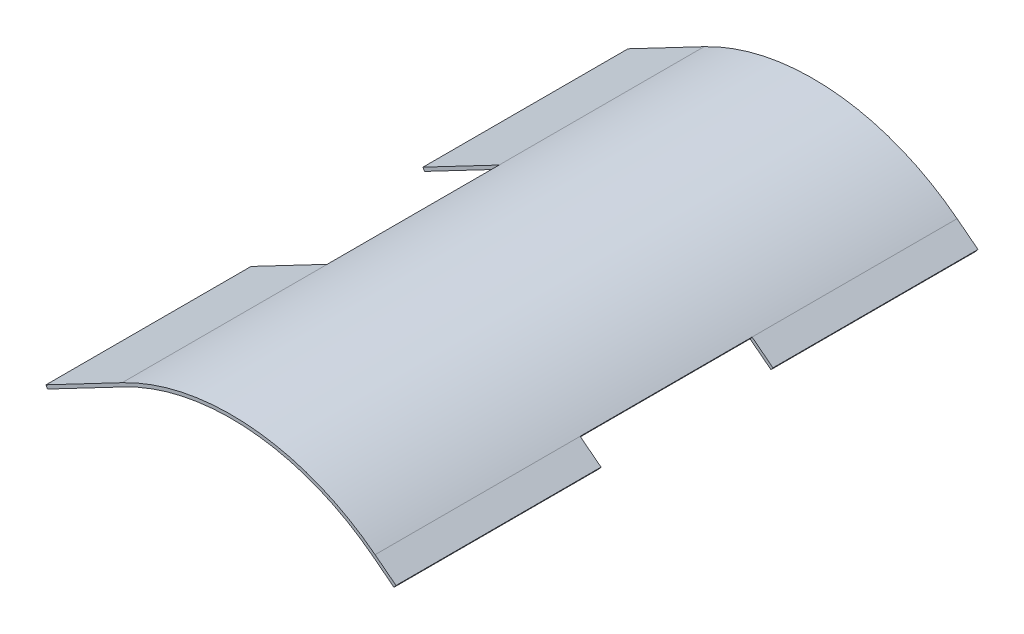
ISO-10303-21;
HEADER;
FILE_DESCRIPTION(('STEP AP214'),'2;1');
FILE_NAME('part.step','',(''),(''),'','','');
FILE_SCHEMA(('AUTOMOTIVE_DESIGN { 1 0 10303 214 1 1 1 1 }'));
ENDSEC;
DATA;
#1=APPLICATION_CONTEXT('core data for automotive mechanical design processes');
#2=APPLICATION_PROTOCOL_DEFINITION('international standard','automotive_design',2000,#1);
#3=PRODUCT_CONTEXT('',#1,'mechanical');
#4=PRODUCT('Part','Part','',(#3));
#5=PRODUCT_RELATED_PRODUCT_CATEGORY('part','',(#4));
#6=PRODUCT_DEFINITION_FORMATION('','',#4);
#7=PRODUCT_DEFINITION_CONTEXT('part definition',#1,'design');
#8=PRODUCT_DEFINITION('design','',#6,#7);
#9=PRODUCT_DEFINITION_SHAPE('','',#8);
#10=(LENGTH_UNIT() NAMED_UNIT(*) SI_UNIT(.MILLI.,.METRE.));
#11=(NAMED_UNIT(*) PLANE_ANGLE_UNIT() SI_UNIT($,.RADIAN.));
#12=(NAMED_UNIT(*) SI_UNIT($,.STERADIAN.) SOLID_ANGLE_UNIT());
#13=UNCERTAINTY_MEASURE_WITH_UNIT(LENGTH_MEASURE(1.E-05),#10,'distance_accuracy_value','');
#14=(GEOMETRIC_REPRESENTATION_CONTEXT(3) GLOBAL_UNCERTAINTY_ASSIGNED_CONTEXT((#13)) GLOBAL_UNIT_ASSIGNED_CONTEXT((#10,
#11,#12)) REPRESENTATION_CONTEXT('',''));
#15=CARTESIAN_POINT('',(0.,0.,0.));
#16=DIRECTION('',(0.,0.,1.));
#17=DIRECTION('',(1.,0.,0.));
#18=AXIS2_PLACEMENT_3D('',#15,#16,#17);
#19=CARTESIAN_POINT('',(-21.0383880749726,192.989081420878,44.));
#20=DIRECTION('',(-0.613188912143639,-0.789936299978739,0.));
#21=DIRECTION('',(0.789936299978739,-0.613188912143639,0.));
#22=AXIS2_PLACEMENT_3D('',#19,#20,#21);
#23=PLANE('',#22);
#24=DIRECTION('',(-0.789936299978739,0.613188912143639,0.));
#25=VECTOR('',#24,1.);
#26=CARTESIAN_POINT('',(-21.0383880749726,192.989081420878,-13.));
#27=LINE('',#26,#25);
#28=CARTESIAN_POINT('',(-17.8786428750577,190.536325772303,-13.));
#29=VERTEX_POINT('',#28);
#30=CARTESIAN_POINT('',(-21.0383880749726,192.989081420878,-13.));
#31=VERTEX_POINT('',#30);
#32=EDGE_CURVE('E144',#29,#31,#27,.T.);
#33=ORIENTED_EDGE('',*,*,#32,.T.);
#34=DIRECTION('',(0.,0.,-1.));
#35=VECTOR('',#34,1.);
#36=CARTESIAN_POINT('',(-21.0383880749726,192.989081420878,44.));
#37=LINE('',#36,#35);
#38=CARTESIAN_POINT('',(-21.0383880749726,192.989081420878,-44.));
#39=VERTEX_POINT('',#38);
#40=EDGE_CURVE('E171',#31,#39,#37,.T.);
#41=ORIENTED_EDGE('',*,*,#40,.T.);
#42=DIRECTION('',(-0.789936299978739,0.613188912143639,0.));
#43=VECTOR('',#42,1.);
#44=CARTESIAN_POINT('',(-21.0383880749726,192.989081420878,-44.));
#45=LINE('',#44,#43);
#46=CARTESIAN_POINT('',(-17.8786428750577,190.536325772303,-44.));
#47=VERTEX_POINT('',#46);
#48=EDGE_CURVE('E165',#47,#39,#45,.T.);
#49=ORIENTED_EDGE('',*,*,#48,.F.);
#50=DIRECTION('',(0.,0.,-1.));
#51=VECTOR('',#50,1.);
#52=CARTESIAN_POINT('',(-17.8786428750577,190.536325772303,44.));
#53=LINE('',#52,#51);
#54=EDGE_CURVE('E159',#29,#47,#53,.T.);
#55=ORIENTED_EDGE('',*,*,#54,.F.);
#56=EDGE_LOOP('',(#33,#41,#49,#55));
#57=FACE_BOUND('',#56,.T.);
#58=ADVANCED_FACE('F31',(#57),#23,.T.);
#59=CARTESIAN_POINT('',(-17.5720484189859,190.931293922292,44.));
#60=DIRECTION('',(0.789936299978745,-0.613188912143631,0.));
#61=DIRECTION('',(0.613188912143631,0.789936299978745,0.));
#62=AXIS2_PLACEMENT_3D('',#59,#60,#61);
#63=PLANE('',#62);
#64=DIRECTION('',(0.613188912143637,0.789936299978741,0.));
#65=VECTOR('',#64,1.);
#66=CARTESIAN_POINT('',(-37.7745056202216,164.905620633072,-13.));
#67=LINE('',#66,#65);
#68=CARTESIAN_POINT('',(-17.572048418986,190.931293922292,-13.));
#69=VERTEX_POINT('',#68);
#70=EDGE_CURVE('E147',#29,#69,#67,.T.);
#71=ORIENTED_EDGE('',*,*,#70,.F.);
#72=ORIENTED_EDGE('',*,*,#54,.T.);
#73=DIRECTION('',(-0.613188912143631,-0.789936299978745,0.));
#74=VECTOR('',#73,1.);
#75=CARTESIAN_POINT('',(-17.5720484189859,190.931293922292,-44.));
#76=LINE('',#75,#74);
#77=CARTESIAN_POINT('',(-17.5720484189859,190.931293922292,-44.));
#78=VERTEX_POINT('',#77);
#79=EDGE_CURVE('E218',#78,#47,#76,.T.);
#80=ORIENTED_EDGE('',*,*,#79,.F.);
#81=DIRECTION('',(0.,0.,-1.));
#82=VECTOR('',#81,1.);
#83=CARTESIAN_POINT('',(-17.5720484189859,190.931293922292,44.));
#84=LINE('',#83,#82);
#85=EDGE_CURVE('E161',#69,#78,#84,.T.);
#86=ORIENTED_EDGE('',*,*,#85,.F.);
#87=EDGE_LOOP('',(#71,#72,#80,#86));
#88=FACE_BOUND('',#87,.T.);
#89=ADVANCED_FACE('F157',(#88),#63,.T.);
#90=CARTESIAN_POINT('',(-20.7317936189008,193.384049570867,44.));
#91=DIRECTION('',(-0.613188912143639,-0.789936299978739,0.));
#92=DIRECTION('',(0.789936299978739,-0.613188912143639,0.));
#93=AXIS2_PLACEMENT_3D('',#90,#91,#92);
#94=PLANE('',#93);
#95=DIRECTION('',(0.,0.,-1.));
#96=VECTOR('',#95,1.);
#97=CARTESIAN_POINT('',(-20.7317936189008,193.384049570867,44.));
#98=LINE('',#97,#96);
#99=CARTESIAN_POINT('',(-20.7317936189008,193.384049570867,-13.));
#100=VERTEX_POINT('',#99);
#101=CARTESIAN_POINT('',(-20.7317936189008,193.384049570867,-44.));
#102=VERTEX_POINT('',#101);
#103=EDGE_CURVE('E229',#100,#102,#98,.T.);
#104=ORIENTED_EDGE('',*,*,#103,.F.);
#105=DIRECTION('',(-0.789936299978741,0.613188912143637,0.));
#106=VECTOR('',#105,1.);
#107=CARTESIAN_POINT('',(-20.731793618901,193.384049570867,-13.));
#108=LINE('',#107,#106);
#109=EDGE_CURVE('E46',#69,#100,#108,.T.);
#110=ORIENTED_EDGE('',*,*,#109,.F.);
#111=ORIENTED_EDGE('',*,*,#85,.T.);
#112=DIRECTION('',(-0.789936299978739,0.613188912143639,0.));
#113=VECTOR('',#112,1.);
#114=CARTESIAN_POINT('',(-20.7317936189008,193.384049570867,-44.));
#115=LINE('',#114,#113);
#116=EDGE_CURVE('E220',#78,#102,#115,.T.);
#117=ORIENTED_EDGE('',*,*,#116,.T.);
#118=EDGE_LOOP('',(#104,#110,#111,#117));
#119=FACE_BOUND('',#118,.T.);
#120=ADVANCED_FACE('F244',(#119),#94,.F.);
#121=CARTESIAN_POINT('',(-58.9801921922615,196.784168064479,44.));
#122=DIRECTION('',(0.464230765979194,-0.885714285714288,0.));
#123=DIRECTION('',(0.885714285714288,0.464230765979194,0.));
#124=AXIS2_PLACEMENT_3D('',#121,#122,#123);
#125=PLANE('',#124);
#126=DIRECTION('',(0.,0.,-1.));
#127=VECTOR('',#126,1.);
#128=CARTESIAN_POINT('',(-70.4944779065472,190.749168106749,44.));
#129=LINE('',#128,#127);
#130=CARTESIAN_POINT('',(-70.4944779065473,190.74916810675,-13.));
#131=VERTEX_POINT('',#130);
#132=CARTESIAN_POINT('',(-70.4944779065472,190.749168106749,-44.));
#133=VERTEX_POINT('',#132);
#134=EDGE_CURVE('E39',#131,#133,#129,.T.);
#135=ORIENTED_EDGE('',*,*,#134,.F.);
#136=DIRECTION('',(-0.885714285714284,-0.4642307659792,0.));
#137=VECTOR('',#136,1.);
#138=CARTESIAN_POINT('',(-70.4944779065473,190.74916810675,-13.));
#139=LINE('',#138,#137);
#140=CARTESIAN_POINT('',(-58.9801921922616,196.784168064479,-13.));
#141=VERTEX_POINT('',#140);
#142=EDGE_CURVE('E278',#141,#131,#139,.T.);
#143=ORIENTED_EDGE('',*,*,#142,.F.);
#144=DIRECTION('',(0.,0.,-1.));
#145=VECTOR('',#144,1.);
#146=CARTESIAN_POINT('',(-58.9801921922615,196.784168064479,44.));
#147=LINE('',#146,#145);
#148=CARTESIAN_POINT('',(-58.9801921922615,196.784168064479,-44.));
#149=VERTEX_POINT('',#148);
#150=EDGE_CURVE('E230',#141,#149,#147,.T.);
#151=ORIENTED_EDGE('',*,*,#150,.T.);
#152=DIRECTION('',(-0.885714285714288,-0.464230765979194,0.));
#153=VECTOR('',#152,1.);
#154=CARTESIAN_POINT('',(-58.9801921922615,196.784168064479,-44.));
#155=LINE('',#154,#153);
#156=EDGE_CURVE('E208',#149,#133,#155,.T.);
#157=ORIENTED_EDGE('',*,*,#156,.T.);
#158=EDGE_LOOP('',(#135,#143,#151,#157));
#159=FACE_BOUND('',#158,.T.);
#160=ADVANCED_FACE('F362',(#159),#125,.F.);
#161=CARTESIAN_POINT('',(-70.2623625235576,190.306310963892,44.));
#162=DIRECTION('',(-0.88571428571429,-0.46423076597919,0.));
#163=DIRECTION('',(0.46423076597919,-0.88571428571429,0.));
#164=AXIS2_PLACEMENT_3D('',#161,#162,#163);
#165=PLANE('',#164);
#166=DIRECTION('',(-0.4642307659792,0.885714285714285,0.));
#167=VECTOR('',#166,1.);
#168=CARTESIAN_POINT('',(-58.9064354917305,168.640132121991,-13.));
#169=LINE('',#168,#167);
#170=CARTESIAN_POINT('',(-70.2623625235576,190.306310963892,-13.));
#171=VERTEX_POINT('',#170);
#172=EDGE_CURVE('E269',#171,#131,#169,.T.);
#173=ORIENTED_EDGE('',*,*,#172,.T.);
#174=ORIENTED_EDGE('',*,*,#134,.T.);
#175=DIRECTION('',(-0.46423076597919,0.88571428571429,0.));
#176=VECTOR('',#175,1.);
#177=CARTESIAN_POINT('',(-70.2623625235576,190.306310963892,-44.));
#178=LINE('',#177,#176);
#179=CARTESIAN_POINT('',(-70.2623625235576,190.306310963892,-44.));
#180=VERTEX_POINT('',#179);
#181=EDGE_CURVE('E202',#180,#133,#178,.T.);
#182=ORIENTED_EDGE('',*,*,#181,.F.);
#183=DIRECTION('',(0.,0.,-1.));
#184=VECTOR('',#183,1.);
#185=CARTESIAN_POINT('',(-70.2623625235576,190.306310963892,44.));
#186=LINE('',#185,#184);
#187=EDGE_CURVE('E182',#171,#180,#186,.T.);
#188=ORIENTED_EDGE('',*,*,#187,.F.);
#189=EDGE_LOOP('',(#173,#174,#182,#188));
#190=FACE_BOUND('',#189,.T.);
#191=ADVANCED_FACE('F203',(#190),#165,.T.);
#192=CARTESIAN_POINT('',(-58.7480768092719,196.341310921622,44.));
#193=DIRECTION('',(0.464230765979194,-0.885714285714288,0.));
#194=DIRECTION('',(0.885714285714288,0.464230765979194,0.));
#195=AXIS2_PLACEMENT_3D('',#192,#193,#194);
#196=PLANE('',#195);
#197=DIRECTION('',(-0.885714285714288,-0.464230765979194,0.));
#198=VECTOR('',#197,1.);
#199=CARTESIAN_POINT('',(-70.2623625235575,190.306310963892,-13.));
#200=LINE('',#199,#198);
#201=CARTESIAN_POINT('',(-58.7480768092719,196.341310921622,-13.));
#202=VERTEX_POINT('',#201);
#203=EDGE_CURVE('E198',#202,#171,#200,.T.);
#204=ORIENTED_EDGE('',*,*,#203,.T.);
#205=ORIENTED_EDGE('',*,*,#187,.T.);
#206=DIRECTION('',(-0.885714285714288,-0.464230765979194,0.));
#207=VECTOR('',#206,1.);
#208=CARTESIAN_POINT('',(-58.7480768092719,196.341310921622,-44.));
#209=LINE('',#208,#207);
#210=CARTESIAN_POINT('',(-58.7480768092719,196.341310921622,-44.));
#211=VERTEX_POINT('',#210);
#212=EDGE_CURVE('E196',#211,#180,#209,.T.);
#213=ORIENTED_EDGE('',*,*,#212,.F.);
#214=DIRECTION('',(0.,0.,-1.));
#215=VECTOR('',#214,1.);
#216=CARTESIAN_POINT('',(-58.7480768092719,196.341310921622,44.));
#217=LINE('',#216,#215);
#218=EDGE_CURVE('E179',#202,#211,#217,.T.);
#219=ORIENTED_EDGE('',*,*,#218,.F.);
#220=EDGE_LOOP('',(#204,#205,#213,#219));
#221=FACE_BOUND('',#220,.T.);
#222=ADVANCED_FACE('F193',(#221),#196,.T.);
#223=CARTESIAN_POINT('',(-58.9801921922615,196.784168064479,44.));
#224=VERTEX_POINT('',#223);
#225=CARTESIAN_POINT('',(-58.9801921922615,196.784168064479,13.));
#226=VERTEX_POINT('',#225);
#227=EDGE_CURVE('E227',#224,#226,#147,.T.);
#228=ORIENTED_EDGE('',*,*,#227,.T.);
#229=DIRECTION('',(0.885714285714284,0.4642307659792,0.));
#230=VECTOR('',#229,1.);
#231=CARTESIAN_POINT('',(-70.4944779065473,190.74916810675,13.));
#232=LINE('',#231,#230);
#233=CARTESIAN_POINT('',(-70.4944779065473,190.74916810675,13.));
#234=VERTEX_POINT('',#233);
#235=EDGE_CURVE('E54',#234,#226,#232,.T.);
#236=ORIENTED_EDGE('',*,*,#235,.F.);
#237=CARTESIAN_POINT('',(-70.4944779065472,190.749168106749,44.));
#238=VERTEX_POINT('',#237);
#239=EDGE_CURVE('E11',#238,#234,#129,.T.);
#240=ORIENTED_EDGE('',*,*,#239,.F.);
#241=DIRECTION('',(-0.885714285714288,-0.464230765979194,0.));
#242=VECTOR('',#241,1.);
#243=CARTESIAN_POINT('',(-58.9801921922615,196.784168064479,44.));
#244=LINE('',#243,#242);
#245=EDGE_CURVE('E226',#224,#238,#244,.T.);
#246=ORIENTED_EDGE('',*,*,#245,.F.);
#247=EDGE_LOOP('',(#228,#236,#240,#246));
#248=FACE_BOUND('',#247,.T.);
#249=ADVANCED_FACE('F33',(#248),#125,.F.);
#250=DIRECTION('',(-0.4642307659792,0.885714285714285,0.));
#251=VECTOR('',#250,1.);
#252=CARTESIAN_POINT('',(-58.9064354917305,168.640132121991,13.));
#253=LINE('',#252,#251);
#254=CARTESIAN_POINT('',(-70.2623625235576,190.306310963892,13.));
#255=VERTEX_POINT('',#254);
#256=EDGE_CURVE('E271',#255,#234,#253,.T.);
#257=ORIENTED_EDGE('',*,*,#256,.F.);
#258=CARTESIAN_POINT('',(-70.2623625235576,190.306310963892,44.));
#259=VERTEX_POINT('',#258);
#260=EDGE_CURVE('E183',#259,#255,#186,.T.);
#261=ORIENTED_EDGE('',*,*,#260,.F.);
#262=DIRECTION('',(-0.46423076597919,0.88571428571429,0.));
#263=VECTOR('',#262,1.);
#264=CARTESIAN_POINT('',(-70.2623625235576,190.306310963892,44.));
#265=LINE('',#264,#263);
#266=EDGE_CURVE('E265',#259,#238,#265,.T.);
#267=ORIENTED_EDGE('',*,*,#266,.T.);
#268=ORIENTED_EDGE('',*,*,#239,.T.);
#269=EDGE_LOOP('',(#257,#261,#267,#268));
#270=FACE_BOUND('',#269,.T.);
#271=ADVANCED_FACE('F326',(#270),#165,.T.);
#272=DIRECTION('',(0.885714285714288,0.464230765979194,0.));
#273=VECTOR('',#272,1.);
#274=CARTESIAN_POINT('',(-70.2623625235575,190.306310963892,13.));
#275=LINE('',#274,#273);
#276=CARTESIAN_POINT('',(-58.7480768092719,196.341310921622,13.));
#277=VERTEX_POINT('',#276);
#278=EDGE_CURVE('E281',#255,#277,#275,.T.);
#279=ORIENTED_EDGE('',*,*,#278,.T.);
#280=CARTESIAN_POINT('',(-58.7480768092719,196.341310921622,44.));
#281=VERTEX_POINT('',#280);
#282=EDGE_CURVE('E180',#281,#277,#217,.T.);
#283=ORIENTED_EDGE('',*,*,#282,.F.);
#284=DIRECTION('',(-0.885714285714288,-0.464230765979194,0.));
#285=VECTOR('',#284,1.);
#286=CARTESIAN_POINT('',(-58.7480768092719,196.341310921622,44.));
#287=LINE('',#286,#285);
#288=EDGE_CURVE('E263',#281,#259,#287,.T.);
#289=ORIENTED_EDGE('',*,*,#288,.T.);
#290=ORIENTED_EDGE('',*,*,#260,.T.);
#291=EDGE_LOOP('',(#279,#283,#289,#290));
#292=FACE_BOUND('',#291,.T.);
#293=ADVANCED_FACE('F327',(#292),#196,.T.);
#294=CARTESIAN_POINT('',(-42.5,165.341310921622,44.));
#295=DIRECTION('',(0.,0.,-1.));
#296=DIRECTION('',(-1.,0.,0.));
#297=AXIS2_PLACEMENT_3D('',#294,#295,#296);
#298=CYLINDRICAL_SURFACE('',#297,35.);
#299=CARTESIAN_POINT('',(-42.5,165.341310921622,-44.));
#300=DIRECTION('',(0.,0.,1.));
#301=DIRECTION('',(1.,0.,0.));
#302=AXIS2_PLACEMENT_3D('',#299,#300,#301);
#303=CIRCLE('',#302,35.);
#304=EDGE_CURVE('E212',#39,#211,#303,.T.);
#305=ORIENTED_EDGE('',*,*,#304,.F.);
#306=ORIENTED_EDGE('',*,*,#40,.F.);
#307=DIRECTION('',(0.,0.,-1.));
#308=VECTOR('',#307,1.);
#309=CARTESIAN_POINT('',(-21.0383880749726,192.989081420878,44.));
#310=LINE('',#309,#308);
#311=CARTESIAN_POINT('',(-21.0383880749726,192.989081420878,13.));
#312=VERTEX_POINT('',#311);
#313=EDGE_CURVE('E153',#312,#31,#310,.T.);
#314=ORIENTED_EDGE('',*,*,#313,.F.);
#315=CARTESIAN_POINT('',(-21.0383880749726,192.989081420878,44.));
#316=VERTEX_POINT('',#315);
#317=EDGE_CURVE('E176',#316,#312,#37,.T.);
#318=ORIENTED_EDGE('',*,*,#317,.F.);
#319=CARTESIAN_POINT('',(-42.5,165.341310921622,44.));
#320=DIRECTION('',(0.,0.,1.));
#321=DIRECTION('',(1.,0.,0.));
#322=AXIS2_PLACEMENT_3D('',#319,#320,#321);
#323=CIRCLE('',#322,35.);
#324=EDGE_CURVE('E260',#316,#281,#323,.T.);
#325=ORIENTED_EDGE('',*,*,#324,.T.);
#326=ORIENTED_EDGE('',*,*,#282,.T.);
#327=DIRECTION('',(0.,0.,-1.));
#328=VECTOR('',#327,1.);
#329=CARTESIAN_POINT('',(-58.7480768092719,196.341310921622,44.));
#330=LINE('',#329,#328);
#331=EDGE_CURVE('E283',#277,#202,#330,.T.);
#332=ORIENTED_EDGE('',*,*,#331,.T.);
#333=ORIENTED_EDGE('',*,*,#218,.T.);
#334=EDGE_LOOP('',(#305,#306,#314,#318,#325,#326,#332,#333));
#335=FACE_BOUND('',#334,.T.);
#336=ADVANCED_FACE('F303',(#335),#298,.F.);
#337=DIRECTION('',(0.789936299978739,-0.613188912143639,0.));
#338=VECTOR('',#337,1.);
#339=CARTESIAN_POINT('',(-21.0383880749726,192.989081420878,13.));
#340=LINE('',#339,#338);
#341=CARTESIAN_POINT('',(-17.8786428750577,190.536325772303,13.));
#342=VERTEX_POINT('',#341);
#343=EDGE_CURVE('E286',#312,#342,#340,.T.);
#344=ORIENTED_EDGE('',*,*,#343,.T.);
#345=CARTESIAN_POINT('',(-17.8786428750577,190.536325772303,44.));
#346=VERTEX_POINT('',#345);
#347=EDGE_CURVE('E167',#346,#342,#53,.T.);
#348=ORIENTED_EDGE('',*,*,#347,.F.);
#349=DIRECTION('',(-0.789936299978739,0.613188912143639,0.));
#350=VECTOR('',#349,1.);
#351=CARTESIAN_POINT('',(-21.0383880749726,192.989081420878,44.));
#352=LINE('',#351,#350);
#353=EDGE_CURVE('E257',#346,#316,#352,.T.);
#354=ORIENTED_EDGE('',*,*,#353,.T.);
#355=ORIENTED_EDGE('',*,*,#317,.T.);
#356=EDGE_LOOP('',(#344,#348,#354,#355));
#357=FACE_BOUND('',#356,.T.);
#358=ADVANCED_FACE('F306',(#357),#23,.T.);
#359=DIRECTION('',(0.613188912143637,0.789936299978741,0.));
#360=VECTOR('',#359,1.);
#361=CARTESIAN_POINT('',(-37.7745056202215,164.905620633072,13.));
#362=LINE('',#361,#360);
#363=CARTESIAN_POINT('',(-17.572048418986,190.931293922292,13.));
#364=VERTEX_POINT('',#363);
#365=EDGE_CURVE('E162',#342,#364,#362,.T.);
#366=ORIENTED_EDGE('',*,*,#365,.T.);
#367=CARTESIAN_POINT('',(-17.5720484189859,190.931293922292,44.));
#368=VERTEX_POINT('',#367);
#369=EDGE_CURVE('E168',#368,#364,#84,.T.);
#370=ORIENTED_EDGE('',*,*,#369,.F.);
#371=DIRECTION('',(-0.613188912143631,-0.789936299978745,0.));
#372=VECTOR('',#371,1.);
#373=CARTESIAN_POINT('',(-17.5720484189859,190.931293922292,44.));
#374=LINE('',#373,#372);
#375=EDGE_CURVE('E254',#368,#346,#374,.T.);
#376=ORIENTED_EDGE('',*,*,#375,.T.);
#377=ORIENTED_EDGE('',*,*,#347,.T.);
#378=EDGE_LOOP('',(#366,#370,#376,#377));
#379=FACE_BOUND('',#378,.T.);
#380=ADVANCED_FACE('F313',(#379),#63,.T.);
#381=ORIENTED_EDGE('',*,*,#369,.T.);
#382=DIRECTION('',(0.78993629997874,-0.613188912143638,0.));
#383=VECTOR('',#382,1.);
#384=CARTESIAN_POINT('',(-20.731793618901,193.384049570867,13.));
#385=LINE('',#384,#383);
#386=CARTESIAN_POINT('',(-20.731793618901,193.384049570867,13.));
#387=VERTEX_POINT('',#386);
#388=EDGE_CURVE('E295',#387,#364,#385,.T.);
#389=ORIENTED_EDGE('',*,*,#388,.F.);
#390=CARTESIAN_POINT('',(-20.7317936189008,193.384049570867,44.));
#391=VERTEX_POINT('',#390);
#392=EDGE_CURVE('E231',#391,#387,#98,.T.);
#393=ORIENTED_EDGE('',*,*,#392,.F.);
#394=DIRECTION('',(-0.789936299978739,0.613188912143639,0.));
#395=VECTOR('',#394,1.);
#396=CARTESIAN_POINT('',(-20.7317936189008,193.384049570867,44.));
#397=LINE('',#396,#395);
#398=EDGE_CURVE('E252',#368,#391,#397,.T.);
#399=ORIENTED_EDGE('',*,*,#398,.F.);
#400=EDGE_LOOP('',(#381,#389,#393,#399));
#401=FACE_BOUND('',#400,.T.);
#402=ADVANCED_FACE('F317',(#401),#94,.F.);
#403=CARTESIAN_POINT('',(-42.5,165.341310921622,44.));
#404=DIRECTION('',(0.,0.,-1.));
#405=DIRECTION('',(-1.,0.,0.));
#406=AXIS2_PLACEMENT_3D('',#403,#404,#405);
#407=CYLINDRICAL_SURFACE('',#406,35.5);
#408=CARTESIAN_POINT('',(-42.5,165.341310921622,-44.));
#409=DIRECTION('',(0.,0.,1.));
#410=DIRECTION('',(1.,0.,0.));
#411=AXIS2_PLACEMENT_3D('',#408,#409,#410);
#412=CIRCLE('',#411,35.5);
#413=EDGE_CURVE('E223',#102,#149,#412,.T.);
#414=ORIENTED_EDGE('',*,*,#413,.T.);
#415=ORIENTED_EDGE('',*,*,#150,.F.);
#416=DIRECTION('',(0.,0.,-1.));
#417=VECTOR('',#416,1.);
#418=CARTESIAN_POINT('',(-58.9801921922616,196.784168064479,-13.));
#419=LINE('',#418,#417);
#420=EDGE_CURVE('E272',#226,#141,#419,.T.);
#421=ORIENTED_EDGE('',*,*,#420,.F.);
#422=ORIENTED_EDGE('',*,*,#227,.F.);
#423=CARTESIAN_POINT('',(-42.5,165.341310921622,44.));
#424=DIRECTION('',(0.,0.,1.));
#425=DIRECTION('',(1.,0.,0.));
#426=AXIS2_PLACEMENT_3D('',#423,#424,#425);
#427=CIRCLE('',#426,35.5);
#428=EDGE_CURVE('E250',#391,#224,#427,.T.);
#429=ORIENTED_EDGE('',*,*,#428,.F.);
#430=ORIENTED_EDGE('',*,*,#392,.T.);
#431=DIRECTION('',(0.,0.,1.));
#432=VECTOR('',#431,1.);
#433=CARTESIAN_POINT('',(-20.731793618901,193.384049570867,-13.));
#434=LINE('',#433,#432);
#435=EDGE_CURVE('E152',#100,#387,#434,.T.);
#436=ORIENTED_EDGE('',*,*,#435,.F.);
#437=ORIENTED_EDGE('',*,*,#103,.T.);
#438=EDGE_LOOP('',(#414,#415,#421,#422,#429,#430,#436,#437));
#439=FACE_BOUND('',#438,.T.);
#440=ADVANCED_FACE('F238',(#439),#407,.T.);
#441=CARTESIAN_POINT('',(-42.5,165.341310921622,44.));
#442=DIRECTION('',(0.,0.,1.));
#443=DIRECTION('',(1.,0.,0.));
#444=AXIS2_PLACEMENT_3D('',#441,#442,#443);
#445=PLANE('',#444);
#446=ORIENTED_EDGE('',*,*,#245,.T.);
#447=ORIENTED_EDGE('',*,*,#266,.F.);
#448=ORIENTED_EDGE('',*,*,#288,.F.);
#449=ORIENTED_EDGE('',*,*,#324,.F.);
#450=ORIENTED_EDGE('',*,*,#353,.F.);
#451=ORIENTED_EDGE('',*,*,#375,.F.);
#452=ORIENTED_EDGE('',*,*,#398,.T.);
#453=ORIENTED_EDGE('',*,*,#428,.T.);
#454=EDGE_LOOP('',(#446,#447,#448,#449,#450,#451,#452,#453));
#455=FACE_BOUND('',#454,.T.);
#456=ADVANCED_FACE('F310',(#455),#445,.T.);
#457=CARTESIAN_POINT('',(-42.5,165.341310921622,-44.));
#458=DIRECTION('',(0.,0.,1.));
#459=DIRECTION('',(1.,0.,0.));
#460=AXIS2_PLACEMENT_3D('',#457,#458,#459);
#461=PLANE('',#460);
#462=ORIENTED_EDGE('',*,*,#156,.F.);
#463=ORIENTED_EDGE('',*,*,#413,.F.);
#464=ORIENTED_EDGE('',*,*,#116,.F.);
#465=ORIENTED_EDGE('',*,*,#79,.T.);
#466=ORIENTED_EDGE('',*,*,#48,.T.);
#467=ORIENTED_EDGE('',*,*,#304,.T.);
#468=ORIENTED_EDGE('',*,*,#212,.T.);
#469=ORIENTED_EDGE('',*,*,#181,.T.);
#470=EDGE_LOOP('',(#462,#463,#464,#465,#466,#467,#468,#469));
#471=FACE_BOUND('',#470,.T.);
#472=ADVANCED_FACE('F210',(#471),#461,.F.);
#473=CARTESIAN_POINT('',(-58.9064354917305,168.640132121991,-13.));
#474=DIRECTION('',(0.,0.,-1.));
#475=DIRECTION('',(-1.,0.,0.));
#476=AXIS2_PLACEMENT_3D('',#473,#474,#475);
#477=PLANE('',#476);
#478=DIRECTION('',(-0.4642307659792,0.885714285714285,0.));
#479=VECTOR('',#478,1.);
#480=CARTESIAN_POINT('',(-47.3921497774448,174.67513207972,-13.));
#481=LINE('',#480,#479);
#482=EDGE_CURVE('E246',#202,#141,#481,.T.);
#483=ORIENTED_EDGE('',*,*,#482,.T.);
#484=ORIENTED_EDGE('',*,*,#142,.T.);
#485=ORIENTED_EDGE('',*,*,#172,.F.);
#486=ORIENTED_EDGE('',*,*,#203,.F.);
#487=EDGE_LOOP('',(#483,#484,#485,#486));
#488=FACE_BOUND('',#487,.T.);
#489=ADVANCED_FACE('F339',(#488),#477,.F.);
#490=CARTESIAN_POINT('',(-47.3921497774448,174.67513207972,-13.));
#491=DIRECTION('',(0.885714285714285,0.4642307659792,0.));
#492=DIRECTION('',(-0.4642307659792,0.885714285714285,0.));
#493=AXIS2_PLACEMENT_3D('',#490,#491,#492);
#494=PLANE('',#493);
#495=DIRECTION('',(-0.4642307659792,0.885714285714285,0.));
#496=VECTOR('',#495,1.);
#497=CARTESIAN_POINT('',(-47.3921497774448,174.67513207972,13.));
#498=LINE('',#497,#496);
#499=EDGE_CURVE('E247',#277,#226,#498,.T.);
#500=ORIENTED_EDGE('',*,*,#499,.T.);
#501=ORIENTED_EDGE('',*,*,#420,.T.);
#502=ORIENTED_EDGE('',*,*,#482,.F.);
#503=ORIENTED_EDGE('',*,*,#331,.F.);
#504=EDGE_LOOP('',(#500,#501,#502,#503));
#505=FACE_BOUND('',#504,.T.);
#506=ADVANCED_FACE('F330',(#505),#494,.F.);
#507=CARTESIAN_POINT('',(-58.9064354917305,168.640132121991,13.));
#508=DIRECTION('',(0.,0.,1.));
#509=DIRECTION('',(1.,0.,0.));
#510=AXIS2_PLACEMENT_3D('',#507,#508,#509);
#511=PLANE('',#510);
#512=ORIENTED_EDGE('',*,*,#256,.T.);
#513=ORIENTED_EDGE('',*,*,#235,.T.);
#514=ORIENTED_EDGE('',*,*,#499,.F.);
#515=ORIENTED_EDGE('',*,*,#278,.F.);
#516=EDGE_LOOP('',(#512,#513,#514,#515));
#517=FACE_BOUND('',#516,.T.);
#518=ADVANCED_FACE('F331',(#517),#511,.F.);
#519=CARTESIAN_POINT('',(-40.9342508201365,167.358376281646,-13.));
#520=DIRECTION('',(-0.789936299978741,0.613188912143637,0.));
#521=DIRECTION('',(-0.613188912143637,-0.789936299978741,0.));
#522=AXIS2_PLACEMENT_3D('',#519,#520,#521);
#523=PLANE('',#522);
#524=DIRECTION('',(0.613188912143637,0.789936299978741,0.));
#525=VECTOR('',#524,1.);
#526=CARTESIAN_POINT('',(-40.9342508201365,167.358376281646,-13.));
#527=LINE('',#526,#525);
#528=EDGE_CURVE('E148',#31,#100,#527,.T.);
#529=ORIENTED_EDGE('',*,*,#528,.T.);
#530=ORIENTED_EDGE('',*,*,#435,.T.);
#531=DIRECTION('',(0.613188912143637,0.789936299978741,0.));
#532=VECTOR('',#531,1.);
#533=CARTESIAN_POINT('',(-40.9342508201365,167.358376281646,13.));
#534=LINE('',#533,#532);
#535=EDGE_CURVE('E289',#312,#387,#534,.T.);
#536=ORIENTED_EDGE('',*,*,#535,.F.);
#537=ORIENTED_EDGE('',*,*,#313,.T.);
#538=EDGE_LOOP('',(#529,#530,#536,#537));
#539=FACE_BOUND('',#538,.T.);
#540=ADVANCED_FACE('F301',(#539),#523,.F.);
#541=CARTESIAN_POINT('',(-40.9342508201365,167.358376281646,-13.));
#542=DIRECTION('',(0.,0.,-1.));
#543=DIRECTION('',(-1.,0.,0.));
#544=AXIS2_PLACEMENT_3D('',#541,#542,#543);
#545=PLANE('',#544);
#546=ORIENTED_EDGE('',*,*,#70,.T.);
#547=ORIENTED_EDGE('',*,*,#109,.T.);
#548=ORIENTED_EDGE('',*,*,#528,.F.);
#549=ORIENTED_EDGE('',*,*,#32,.F.);
#550=EDGE_LOOP('',(#546,#547,#548,#549));
#551=FACE_BOUND('',#550,.T.);
#552=ADVANCED_FACE('F146',(#551),#545,.F.);
#553=CARTESIAN_POINT('',(-40.9342508201365,167.358376281646,13.));
#554=DIRECTION('',(0.,0.,1.));
#555=DIRECTION('',(1.,0.,0.));
#556=AXIS2_PLACEMENT_3D('',#553,#554,#555);
#557=PLANE('',#556);
#558=ORIENTED_EDGE('',*,*,#535,.T.);
#559=ORIENTED_EDGE('',*,*,#388,.T.);
#560=ORIENTED_EDGE('',*,*,#365,.F.);
#561=ORIENTED_EDGE('',*,*,#343,.F.);
#562=EDGE_LOOP('',(#558,#559,#560,#561));
#563=FACE_BOUND('',#562,.T.);
#564=ADVANCED_FACE('F493',(#563),#557,.F.);
#565=CLOSED_SHELL('',(#58,#89,#120,#160,#191,#222,#249,#271,#293,#336,#358,#380,#402,#440,#456,
#472,#489,#506,#518,#540,#552,#564));
#566=MANIFOLD_SOLID_BREP('B2',#565);
#567=ADVANCED_BREP_SHAPE_REPRESENTATION('',(#18,#566),#14);
#568=SHAPE_DEFINITION_REPRESENTATION(#9,#567);
ENDSEC;
END-ISO-10303-21;
